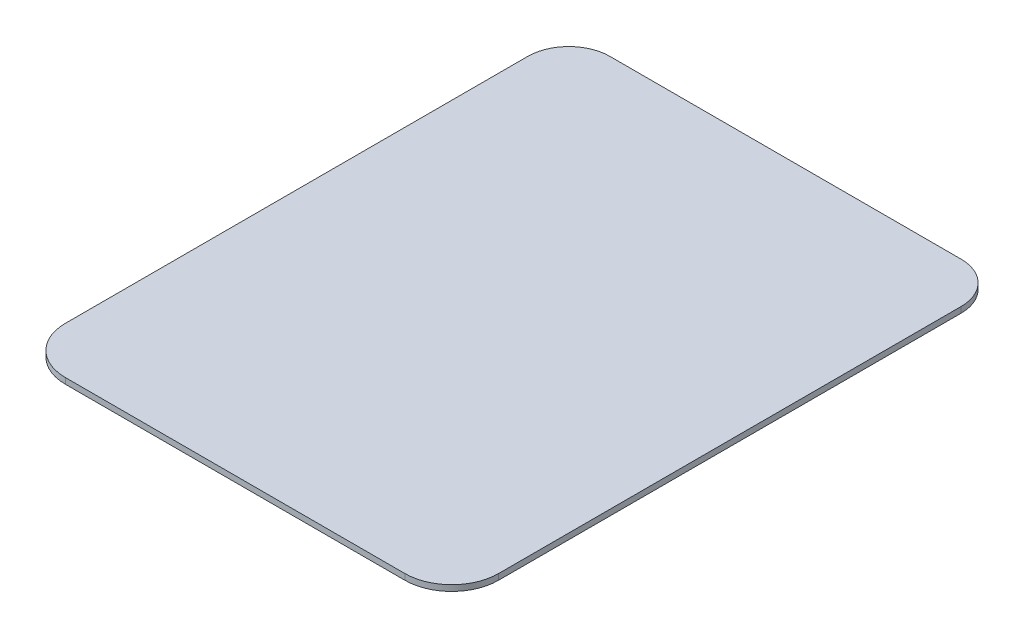
ISO-10303-21;
HEADER;
FILE_DESCRIPTION(('STEP AP214'),'2;1');
FILE_NAME('part.step','',(''),(''),'','','');
FILE_SCHEMA(('AUTOMOTIVE_DESIGN { 1 0 10303 214 1 1 1 1 }'));
ENDSEC;
DATA;
#1=APPLICATION_CONTEXT('core data for automotive mechanical design processes');
#2=APPLICATION_PROTOCOL_DEFINITION('international standard','automotive_design',2000,#1);
#3=PRODUCT_CONTEXT('',#1,'mechanical');
#4=PRODUCT('Part','Part','',(#3));
#5=PRODUCT_RELATED_PRODUCT_CATEGORY('part','',(#4));
#6=PRODUCT_DEFINITION_FORMATION('','',#4);
#7=PRODUCT_DEFINITION_CONTEXT('part definition',#1,'design');
#8=PRODUCT_DEFINITION('design','',#6,#7);
#9=PRODUCT_DEFINITION_SHAPE('','',#8);
#10=(LENGTH_UNIT() NAMED_UNIT(*) SI_UNIT(.MILLI.,.METRE.));
#11=(NAMED_UNIT(*) PLANE_ANGLE_UNIT() SI_UNIT($,.RADIAN.));
#12=(NAMED_UNIT(*) SI_UNIT($,.STERADIAN.) SOLID_ANGLE_UNIT());
#13=UNCERTAINTY_MEASURE_WITH_UNIT(LENGTH_MEASURE(1.E-05),#10,'distance_accuracy_value','');
#14=(GEOMETRIC_REPRESENTATION_CONTEXT(3) GLOBAL_UNCERTAINTY_ASSIGNED_CONTEXT((#13)) GLOBAL_UNIT_ASSIGNED_CONTEXT((#10,
#11,#12)) REPRESENTATION_CONTEXT('',''));
#15=CARTESIAN_POINT('',(0.,0.,0.));
#16=DIRECTION('',(0.,0.,1.));
#17=DIRECTION('',(1.,0.,0.));
#18=AXIS2_PLACEMENT_3D('',#15,#16,#17);
#19=CARTESIAN_POINT('',(29.,1.,39.));
#20=DIRECTION('',(0.,-1.,0.));
#21=DIRECTION('',(0.,0.,-1.));
#22=AXIS2_PLACEMENT_3D('',#19,#20,#21);
#23=CYLINDRICAL_SURFACE('',#22,8.);
#24=CARTESIAN_POINT('',(29.,0.,39.));
#25=DIRECTION('',(0.,1.,0.));
#26=DIRECTION('',(0.,0.,1.));
#27=AXIS2_PLACEMENT_3D('',#24,#25,#26);
#28=CIRCLE('',#27,8.);
#29=CARTESIAN_POINT('',(28.9999999999999,0.,47.));
#30=VERTEX_POINT('',#29);
#31=CARTESIAN_POINT('',(37.,0.,38.9999999999999));
#32=VERTEX_POINT('',#31);
#33=EDGE_CURVE('E128',#30,#32,#28,.T.);
#34=ORIENTED_EDGE('',*,*,#33,.T.);
#35=DIRECTION('',(0.,-1.,0.));
#36=VECTOR('',#35,1.);
#37=CARTESIAN_POINT('',(37.,1.,38.9999999999999));
#38=LINE('',#37,#36);
#39=CARTESIAN_POINT('',(37.,1.,38.9999999999999));
#40=VERTEX_POINT('',#39);
#41=EDGE_CURVE('E11',#40,#32,#38,.T.);
#42=ORIENTED_EDGE('',*,*,#41,.F.);
#43=CARTESIAN_POINT('',(29.,1.,39.));
#44=DIRECTION('',(0.,1.,0.));
#45=DIRECTION('',(0.,0.,1.));
#46=AXIS2_PLACEMENT_3D('',#43,#44,#45);
#47=CIRCLE('',#46,8.);
#48=CARTESIAN_POINT('',(28.9999999999999,1.,47.));
#49=VERTEX_POINT('',#48);
#50=EDGE_CURVE('E142',#49,#40,#47,.T.);
#51=ORIENTED_EDGE('',*,*,#50,.F.);
#52=DIRECTION('',(0.,-1.,0.));
#53=VECTOR('',#52,1.);
#54=CARTESIAN_POINT('',(28.9999999999999,1.,47.));
#55=LINE('',#54,#53);
#56=EDGE_CURVE('E124',#49,#30,#55,.T.);
#57=ORIENTED_EDGE('',*,*,#56,.T.);
#58=EDGE_LOOP('',(#34,#42,#51,#57));
#59=FACE_BOUND('',#58,.T.);
#60=ADVANCED_FACE('F32',(#59),#23,.T.);
#61=CARTESIAN_POINT('',(37.,1.,-40.));
#62=DIRECTION('',(-1.,0.,0.));
#63=DIRECTION('',(0.,0.,1.));
#64=AXIS2_PLACEMENT_3D('',#61,#62,#63);
#65=PLANE('',#64);
#66=DIRECTION('',(0.,0.,-1.));
#67=VECTOR('',#66,1.);
#68=CARTESIAN_POINT('',(37.,0.,-40.));
#69=LINE('',#68,#67);
#70=CARTESIAN_POINT('',(37.,0.,-40.));
#71=VERTEX_POINT('',#70);
#72=EDGE_CURVE('E131',#32,#71,#69,.T.);
#73=ORIENTED_EDGE('',*,*,#72,.T.);
#74=DIRECTION('',(0.,-1.,0.));
#75=VECTOR('',#74,1.);
#76=CARTESIAN_POINT('',(37.,1.,-40.));
#77=LINE('',#76,#75);
#78=CARTESIAN_POINT('',(37.,1.,-40.));
#79=VERTEX_POINT('',#78);
#80=EDGE_CURVE('E40',#79,#71,#77,.T.);
#81=ORIENTED_EDGE('',*,*,#80,.F.);
#82=DIRECTION('',(0.,0.,-1.));
#83=VECTOR('',#82,1.);
#84=CARTESIAN_POINT('',(37.,1.,-40.));
#85=LINE('',#84,#83);
#86=EDGE_CURVE('E91',#40,#79,#85,.T.);
#87=ORIENTED_EDGE('',*,*,#86,.F.);
#88=ORIENTED_EDGE('',*,*,#41,.T.);
#89=EDGE_LOOP('',(#73,#81,#87,#88));
#90=FACE_BOUND('',#89,.T.);
#91=ADVANCED_FACE('F177',(#90),#65,.F.);
#92=CARTESIAN_POINT('',(30.,1.,-40.));
#93=DIRECTION('',(0.,-1.,0.));
#94=DIRECTION('',(0.,0.,-1.));
#95=AXIS2_PLACEMENT_3D('',#92,#93,#94);
#96=CYLINDRICAL_SURFACE('',#95,7.);
#97=CARTESIAN_POINT('',(30.,0.,-40.));
#98=DIRECTION('',(0.,1.,0.));
#99=DIRECTION('',(0.,0.,1.));
#100=AXIS2_PLACEMENT_3D('',#97,#98,#99);
#101=CIRCLE('',#100,7.);
#102=CARTESIAN_POINT('',(30.,0.,-47.));
#103=VERTEX_POINT('',#102);
#104=EDGE_CURVE('E133',#71,#103,#101,.T.);
#105=ORIENTED_EDGE('',*,*,#104,.T.);
#106=DIRECTION('',(0.,-1.,0.));
#107=VECTOR('',#106,1.);
#108=CARTESIAN_POINT('',(30.,1.,-47.));
#109=LINE('',#108,#107);
#110=CARTESIAN_POINT('',(30.,1.,-47.));
#111=VERTEX_POINT('',#110);
#112=EDGE_CURVE('E149',#111,#103,#109,.T.);
#113=ORIENTED_EDGE('',*,*,#112,.F.);
#114=CARTESIAN_POINT('',(30.,1.,-40.));
#115=DIRECTION('',(0.,1.,0.));
#116=DIRECTION('',(0.,0.,1.));
#117=AXIS2_PLACEMENT_3D('',#114,#115,#116);
#118=CIRCLE('',#117,7.);
#119=EDGE_CURVE('E157',#79,#111,#118,.T.);
#120=ORIENTED_EDGE('',*,*,#119,.F.);
#121=ORIENTED_EDGE('',*,*,#80,.T.);
#122=EDGE_LOOP('',(#105,#113,#120,#121));
#123=FACE_BOUND('',#122,.T.);
#124=ADVANCED_FACE('F155',(#123),#96,.T.);
#125=CARTESIAN_POINT('',(-29.9999999999999,1.,-47.));
#126=DIRECTION('',(0.,0.,1.));
#127=DIRECTION('',(1.,0.,0.));
#128=AXIS2_PLACEMENT_3D('',#125,#126,#127);
#129=PLANE('',#128);
#130=DIRECTION('',(-1.,0.,0.));
#131=VECTOR('',#130,1.);
#132=CARTESIAN_POINT('',(-29.9999999999999,0.,-47.));
#133=LINE('',#132,#131);
#134=CARTESIAN_POINT('',(-30.,0.,-47.));
#135=VERTEX_POINT('',#134);
#136=EDGE_CURVE('E135',#103,#135,#133,.T.);
#137=ORIENTED_EDGE('',*,*,#136,.T.);
#138=DIRECTION('',(0.,-1.,0.));
#139=VECTOR('',#138,1.);
#140=CARTESIAN_POINT('',(-30.,1.,-47.));
#141=LINE('',#140,#139);
#142=CARTESIAN_POINT('',(-30.,1.,-47.));
#143=VERTEX_POINT('',#142);
#144=EDGE_CURVE('E146',#143,#135,#141,.T.);
#145=ORIENTED_EDGE('',*,*,#144,.F.);
#146=DIRECTION('',(-1.,0.,0.));
#147=VECTOR('',#146,1.);
#148=CARTESIAN_POINT('',(-29.9999999999999,1.,-47.));
#149=LINE('',#148,#147);
#150=EDGE_CURVE('E169',#111,#143,#149,.T.);
#151=ORIENTED_EDGE('',*,*,#150,.F.);
#152=ORIENTED_EDGE('',*,*,#112,.T.);
#153=EDGE_LOOP('',(#137,#145,#151,#152));
#154=FACE_BOUND('',#153,.T.);
#155=ADVANCED_FACE('F165',(#154),#129,.F.);
#156=CARTESIAN_POINT('',(-30.,1.,-40.));
#157=DIRECTION('',(0.,-1.,0.));
#158=DIRECTION('',(0.,0.,-1.));
#159=AXIS2_PLACEMENT_3D('',#156,#157,#158);
#160=CYLINDRICAL_SURFACE('',#159,7.);
#161=CARTESIAN_POINT('',(-30.,0.,-40.));
#162=DIRECTION('',(0.,1.,0.));
#163=DIRECTION('',(0.,0.,-1.));
#164=AXIS2_PLACEMENT_3D('',#161,#162,#163);
#165=CIRCLE('',#164,7.);
#166=CARTESIAN_POINT('',(-37.,0.,-40.));
#167=VERTEX_POINT('',#166);
#168=EDGE_CURVE('E137',#135,#167,#165,.T.);
#169=ORIENTED_EDGE('',*,*,#168,.T.);
#170=DIRECTION('',(0.,-1.,0.));
#171=VECTOR('',#170,1.);
#172=CARTESIAN_POINT('',(-37.,1.,-40.));
#173=LINE('',#172,#171);
#174=CARTESIAN_POINT('',(-37.,1.,-40.));
#175=VERTEX_POINT('',#174);
#176=EDGE_CURVE('E119',#175,#167,#173,.T.);
#177=ORIENTED_EDGE('',*,*,#176,.F.);
#178=CARTESIAN_POINT('',(-30.,1.,-40.));
#179=DIRECTION('',(0.,1.,0.));
#180=DIRECTION('',(0.,0.,-1.));
#181=AXIS2_PLACEMENT_3D('',#178,#179,#180);
#182=CIRCLE('',#181,7.);
#183=EDGE_CURVE('E110',#143,#175,#182,.T.);
#184=ORIENTED_EDGE('',*,*,#183,.F.);
#185=ORIENTED_EDGE('',*,*,#144,.T.);
#186=EDGE_LOOP('',(#169,#177,#184,#185));
#187=FACE_BOUND('',#186,.T.);
#188=ADVANCED_FACE('F168',(#187),#160,.T.);
#189=CARTESIAN_POINT('',(-37.,1.,-40.));
#190=DIRECTION('',(1.,0.,0.));
#191=DIRECTION('',(0.,0.,-1.));
#192=AXIS2_PLACEMENT_3D('',#189,#190,#191);
#193=PLANE('',#192);
#194=DIRECTION('',(0.,0.,1.));
#195=VECTOR('',#194,1.);
#196=CARTESIAN_POINT('',(-37.,0.,-40.));
#197=LINE('',#196,#195);
#198=CARTESIAN_POINT('',(-37.,0.,38.9999999999999));
#199=VERTEX_POINT('',#198);
#200=EDGE_CURVE('E118',#167,#199,#197,.T.);
#201=ORIENTED_EDGE('',*,*,#200,.T.);
#202=DIRECTION('',(0.,-1.,0.));
#203=VECTOR('',#202,1.);
#204=CARTESIAN_POINT('',(-37.,1.,38.9999999999999));
#205=LINE('',#204,#203);
#206=CARTESIAN_POINT('',(-37.,1.,38.9999999999999));
#207=VERTEX_POINT('',#206);
#208=EDGE_CURVE('E115',#207,#199,#205,.T.);
#209=ORIENTED_EDGE('',*,*,#208,.F.);
#210=DIRECTION('',(0.,0.,1.));
#211=VECTOR('',#210,1.);
#212=CARTESIAN_POINT('',(-37.,1.,-40.));
#213=LINE('',#212,#211);
#214=EDGE_CURVE('E104',#175,#207,#213,.T.);
#215=ORIENTED_EDGE('',*,*,#214,.F.);
#216=ORIENTED_EDGE('',*,*,#176,.T.);
#217=EDGE_LOOP('',(#201,#209,#215,#216));
#218=FACE_BOUND('',#217,.T.);
#219=ADVANCED_FACE('F116',(#218),#193,.F.);
#220=CARTESIAN_POINT('',(-29.,1.,39.));
#221=DIRECTION('',(0.,-1.,0.));
#222=DIRECTION('',(0.,0.,-1.));
#223=AXIS2_PLACEMENT_3D('',#220,#221,#222);
#224=CYLINDRICAL_SURFACE('',#223,8.);
#225=CARTESIAN_POINT('',(-29.,0.,39.));
#226=DIRECTION('',(0.,1.,0.));
#227=DIRECTION('',(0.,0.,-1.));
#228=AXIS2_PLACEMENT_3D('',#225,#226,#227);
#229=CIRCLE('',#228,8.);
#230=CARTESIAN_POINT('',(-28.9999999999999,0.,47.));
#231=VERTEX_POINT('',#230);
#232=EDGE_CURVE('E77',#199,#231,#229,.T.);
#233=ORIENTED_EDGE('',*,*,#232,.T.);
#234=DIRECTION('',(0.,-1.,0.));
#235=VECTOR('',#234,1.);
#236=CARTESIAN_POINT('',(-28.9999999999999,1.,47.));
#237=LINE('',#236,#235);
#238=CARTESIAN_POINT('',(-28.9999999999999,1.,47.));
#239=VERTEX_POINT('',#238);
#240=EDGE_CURVE('E120',#239,#231,#237,.T.);
#241=ORIENTED_EDGE('',*,*,#240,.F.);
#242=CARTESIAN_POINT('',(-29.,1.,39.));
#243=DIRECTION('',(0.,1.,0.));
#244=DIRECTION('',(0.,0.,-1.));
#245=AXIS2_PLACEMENT_3D('',#242,#243,#244);
#246=CIRCLE('',#245,8.);
#247=EDGE_CURVE('E108',#207,#239,#246,.T.);
#248=ORIENTED_EDGE('',*,*,#247,.F.);
#249=ORIENTED_EDGE('',*,*,#208,.T.);
#250=EDGE_LOOP('',(#233,#241,#248,#249));
#251=FACE_BOUND('',#250,.T.);
#252=ADVANCED_FACE('F122',(#251),#224,.T.);
#253=CARTESIAN_POINT('',(-28.9999999999999,1.,47.));
#254=DIRECTION('',(0.,0.,-1.));
#255=DIRECTION('',(-1.,0.,0.));
#256=AXIS2_PLACEMENT_3D('',#253,#254,#255);
#257=PLANE('',#256);
#258=DIRECTION('',(1.,0.,0.));
#259=VECTOR('',#258,1.);
#260=CARTESIAN_POINT('',(-28.9999999999999,0.,47.));
#261=LINE('',#260,#259);
#262=EDGE_CURVE('E83',#231,#30,#261,.T.);
#263=ORIENTED_EDGE('',*,*,#262,.T.);
#264=ORIENTED_EDGE('',*,*,#56,.F.);
#265=DIRECTION('',(1.,0.,0.));
#266=VECTOR('',#265,1.);
#267=CARTESIAN_POINT('',(-28.9999999999999,1.,47.));
#268=LINE('',#267,#266);
#269=EDGE_CURVE('E48',#239,#49,#268,.T.);
#270=ORIENTED_EDGE('',*,*,#269,.F.);
#271=ORIENTED_EDGE('',*,*,#240,.T.);
#272=EDGE_LOOP('',(#263,#264,#270,#271));
#273=FACE_BOUND('',#272,.T.);
#274=ADVANCED_FACE('F193',(#273),#257,.F.);
#275=CARTESIAN_POINT('',(29.,1.,39.));
#276=DIRECTION('',(0.,1.,0.));
#277=DIRECTION('',(0.,0.,1.));
#278=AXIS2_PLACEMENT_3D('',#275,#276,#277);
#279=PLANE('',#278);
#280=ORIENTED_EDGE('',*,*,#50,.T.);
#281=ORIENTED_EDGE('',*,*,#86,.T.);
#282=ORIENTED_EDGE('',*,*,#119,.T.);
#283=ORIENTED_EDGE('',*,*,#150,.T.);
#284=ORIENTED_EDGE('',*,*,#183,.T.);
#285=ORIENTED_EDGE('',*,*,#214,.T.);
#286=ORIENTED_EDGE('',*,*,#247,.T.);
#287=ORIENTED_EDGE('',*,*,#269,.T.);
#288=EDGE_LOOP('',(#280,#281,#282,#283,#284,#285,#286,#287));
#289=FACE_BOUND('',#288,.T.);
#290=ADVANCED_FACE('F106',(#289),#279,.T.);
#291=CARTESIAN_POINT('',(29.,0.,39.));
#292=DIRECTION('',(0.,1.,0.));
#293=DIRECTION('',(0.,0.,1.));
#294=AXIS2_PLACEMENT_3D('',#291,#292,#293);
#295=PLANE('',#294);
#296=ORIENTED_EDGE('',*,*,#33,.F.);
#297=ORIENTED_EDGE('',*,*,#262,.F.);
#298=ORIENTED_EDGE('',*,*,#232,.F.);
#299=ORIENTED_EDGE('',*,*,#200,.F.);
#300=ORIENTED_EDGE('',*,*,#168,.F.);
#301=ORIENTED_EDGE('',*,*,#136,.F.);
#302=ORIENTED_EDGE('',*,*,#104,.F.);
#303=ORIENTED_EDGE('',*,*,#72,.F.);
#304=EDGE_LOOP('',(#296,#297,#298,#299,#300,#301,#302,#303));
#305=FACE_BOUND('',#304,.T.);
#306=ADVANCED_FACE('F161',(#305),#295,.F.);
#307=CLOSED_SHELL('',(#60,#91,#124,#155,#188,#219,#252,#274,#290,#306));
#308=MANIFOLD_SOLID_BREP('B2',#307);
#309=ADVANCED_BREP_SHAPE_REPRESENTATION('',(#18,#308),#14);
#310=SHAPE_DEFINITION_REPRESENTATION(#9,#309);
ENDSEC;
END-ISO-10303-21;
